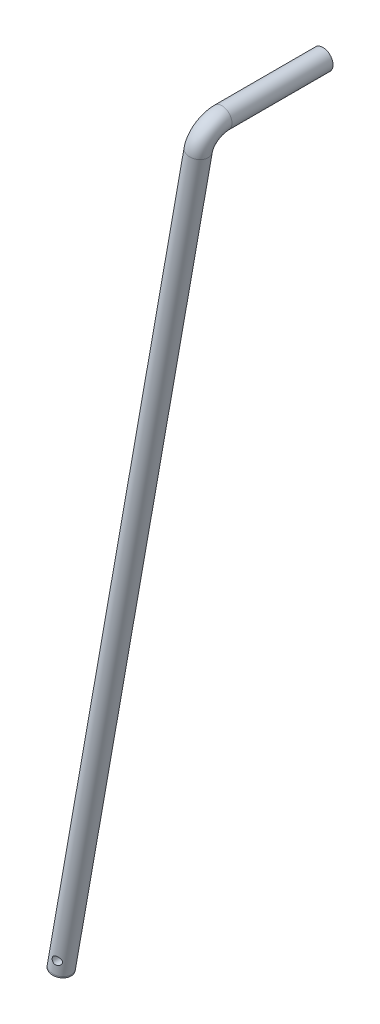
ISO-10303-21;
HEADER;
FILE_DESCRIPTION(('STEP AP214'),'2;1');
FILE_NAME('part.step','',(''),(''),'','','');
FILE_SCHEMA(('AUTOMOTIVE_DESIGN { 1 0 10303 214 1 1 1 1 }'));
ENDSEC;
DATA;
#1=APPLICATION_CONTEXT('core data for automotive mechanical design processes');
#2=APPLICATION_PROTOCOL_DEFINITION('international standard','automotive_design',2000,#1);
#3=PRODUCT_CONTEXT('',#1,'mechanical');
#4=PRODUCT('Part','Part','',(#3));
#5=PRODUCT_RELATED_PRODUCT_CATEGORY('part','',(#4));
#6=PRODUCT_DEFINITION_FORMATION('','',#4);
#7=PRODUCT_DEFINITION_CONTEXT('part definition',#1,'design');
#8=PRODUCT_DEFINITION('design','',#6,#7);
#9=PRODUCT_DEFINITION_SHAPE('','',#8);
#10=(LENGTH_UNIT() NAMED_UNIT(*) SI_UNIT(.MILLI.,.METRE.));
#11=(NAMED_UNIT(*) PLANE_ANGLE_UNIT() SI_UNIT($,.RADIAN.));
#12=(NAMED_UNIT(*) SI_UNIT($,.STERADIAN.) SOLID_ANGLE_UNIT());
#13=UNCERTAINTY_MEASURE_WITH_UNIT(LENGTH_MEASURE(1.E-05),#10,'distance_accuracy_value','');
#14=(GEOMETRIC_REPRESENTATION_CONTEXT(3) GLOBAL_UNCERTAINTY_ASSIGNED_CONTEXT((#13)) GLOBAL_UNIT_ASSIGNED_CONTEXT((#10,
#11,#12)) REPRESENTATION_CONTEXT('',''));
#15=CARTESIAN_POINT('',(0.,0.,0.));
#16=DIRECTION('',(0.,0.,1.));
#17=DIRECTION('',(1.,0.,0.));
#18=AXIS2_PLACEMENT_3D('',#15,#16,#17);
#19=CARTESIAN_POINT('',(285.309286775553,1958.34628023542,-234.999999999999));
#20=DIRECTION('',(0.,0.,1.));
#21=DIRECTION('',(0.,-1.,0.));
#22=AXIS2_PLACEMENT_3D('',#19,#20,#21);
#23=PLANE('',#22);
#24=CARTESIAN_POINT('',(345.309286775553,2018.34628023542,-235.));
#25=DIRECTION('',(0.,0.,-1.));
#26=DIRECTION('',(-0.984807753012209,0.173648177666924,0.));
#27=AXIS2_PLACEMENT_3D('',#24,#25,#26);
#28=CIRCLE('',#27,25.);
#29=CARTESIAN_POINT('',(320.689092950247,2022.68748467709,-235.));
#30=VERTEX_POINT('',#29);
#31=EDGE_CURVE('E12',#30,#30,#28,.T.);
#32=ORIENTED_EDGE('',*,*,#31,.T.);
#33=EDGE_LOOP('',(#32));
#34=FACE_BOUND('',#33,.T.);
#35=ADVANCED_FACE('F50',(#34),#23,.F.);
#36=CARTESIAN_POINT('',(-2.54866712700606,45.5457904583527,65.));
#37=DIRECTION('',(0.173648177666925,0.984807753012209,0.));
#38=DIRECTION('',(-0.984807753012209,0.173648177666925,0.));
#39=AXIS2_PLACEMENT_3D('',#36,#37,#38);
#40=PLANE('',#39);
#41=CARTESIAN_POINT('',(-2.54866712700606,45.5457904583527,65.));
#42=DIRECTION('',(0.173648177666925,0.984807753012209,0.));
#43=DIRECTION('',(-0.984807753012209,0.173648177666925,0.));
#44=AXIS2_PLACEMENT_3D('',#41,#42,#43);
#45=CIRCLE('',#44,25.);
#46=CARTESIAN_POINT('',(-27.1688609523113,49.8869949000258,65.));
#47=VERTEX_POINT('',#46);
#48=EDGE_CURVE('E66',#47,#47,#45,.T.);
#49=ORIENTED_EDGE('',*,*,#48,.F.);
#50=EDGE_LOOP('',(#49));
#51=FACE_BOUND('',#50,.T.);
#52=ADVANCED_FACE('F67',(#51),#40,.F.);
#53=CARTESIAN_POINT('',(-2.54866712700606,45.5457904583527,65.));
#54=DIRECTION('',(0.173648177666924,0.984807753012209,0.));
#55=DIRECTION('',(-0.984807753012209,0.173648177666924,0.));
#56=AXIS2_PLACEMENT_3D('',#53,#54,#55);
#57=CYLINDRICAL_SURFACE('',#56,25.);
#58=CARTESIAN_POINT('',(-1.98706855829563,48.7307742110036,65.));
#59=DIRECTION('',(0.173648177666925,0.984807753012209,0.));
#60=DIRECTION('',(-0.984807753012209,0.173648177666925,0.));
#61=AXIS2_PLACEMENT_3D('',#58,#59,#60);
#62=CIRCLE('',#61,25.);
#63=CARTESIAN_POINT('',(-26.6072623836009,53.0719786526767,65.));
#64=VERTEX_POINT('',#63);
#65=EDGE_CURVE('E69',#64,#64,#62,.T.);
#66=ORIENTED_EDGE('',*,*,#65,.F.);
#67=EDGE_LOOP('',(#66));
#68=FACE_BOUND('',#67,.T.);
#69=ORIENTED_EDGE('',*,*,#48,.T.);
#70=EDGE_LOOP('',(#69));
#71=FACE_BOUND('',#70,.T.);
#72=ADVANCED_FACE('F93',(#68,#71),#57,.T.);
#73=CARTESIAN_POINT('',(-1.98706855829562,48.7307742110036,65.));
#74=DIRECTION('',(0.173648177666924,0.984807753012209,0.));
#75=DIRECTION('',(-0.984807753012209,0.173648177666924,0.));
#76=AXIS2_PLACEMENT_3D('',#73,#74,#75);
#77=CYLINDRICAL_SURFACE('',#76,25.);
#78=CARTESIAN_POINT('',(5.05959495436735,88.694388879334,90.));
#79=CARTESIAN_POINT('',(4.81641099799029,88.5562025731366,89.9999995331166));
#80=CARTESIAN_POINT('',(4.57896534961769,88.4077695870217,89.9972100574864));
#81=CARTESIAN_POINT('',(4.11731780295449,88.0915026848093,89.9872417100885));
#82=CARTESIAN_POINT('',(3.89312380886007,87.9236573628454,89.9800602470415));
#83=CARTESIAN_POINT('',(3.45916867374251,87.5694215729024,89.9625140761051));
#84=CARTESIAN_POINT('',(3.24944168216102,87.382989605847,89.9521421320368));
#85=CARTESIAN_POINT('',(2.84644224802949,86.9932253451614,89.9294465335112));
#86=CARTESIAN_POINT('',(2.65317019114192,86.7898926556413,89.917122833329));
#87=CARTESIAN_POINT('',(2.28468782092185,86.3680661116852,89.8917226092728));
#88=CARTESIAN_POINT('',(2.10945035087738,86.1495959069343,89.8786472649217));
#89=CARTESIAN_POINT('',(1.77789615561468,85.6987118793375,89.8528175922824));
#90=CARTESIAN_POINT('',(1.62158005373771,85.4662975974983,89.840063274581));
#91=CARTESIAN_POINT('',(1.32905775816331,84.989286987599,89.8158595176162));
#92=CARTESIAN_POINT('',(1.19283828860028,84.7446988457455,89.8044092180673));
#93=CARTESIAN_POINT('',(0.9413498689262,84.2448933146005,89.7836292799645));
#94=CARTESIAN_POINT('',(0.826080729154653,83.9896760215589,89.7742996222127));
#95=CARTESIAN_POINT('',(0.616835990789955,83.4691886250571,89.7583719897132));
#96=CARTESIAN_POINT('',(0.522962007835889,83.2038772572979,89.7517869326652));
#97=CARTESIAN_POINT('',(0.357889364471851,82.6662297052887,89.7418627585988));
#98=CARTESIAN_POINT('',(0.286690827073224,82.3938934829384,89.7385236591891));
#99=CARTESIAN_POINT('',(0.167492018318252,81.8441522646798,89.7353174089191));
#100=CARTESIAN_POINT('',(0.119493201642445,81.5667469520584,89.7354504757436));
#101=CARTESIAN_POINT('',(0.0470494898587544,81.008902712,89.7391801974196));
#102=CARTESIAN_POINT('',(0.0226044176324381,80.7284638073909,89.7427768262255));
#103=CARTESIAN_POINT('',(-0.00244064836946922,80.1693958952261,89.7531375517377));
#104=CARTESIAN_POINT('',(-0.00327655242939336,79.890776816982,89.7598696274159));
#105=CARTESIAN_POINT('',(0.0182862748859155,79.334520913439,89.7760361338764));
#106=CARTESIAN_POINT('',(0.0406848729056904,79.0568840825116,89.7854705491484));
#107=CARTESIAN_POINT('',(0.108537222549816,78.5045473650764,89.8063912520517));
#108=CARTESIAN_POINT('',(0.153988949525856,78.2298472228159,89.8178773594351));
#109=CARTESIAN_POINT('',(0.267636640176752,77.6851490488258,89.8420848172385));
#110=CARTESIAN_POINT('',(0.335840604421221,77.4151527063252,89.8548066010533));
#111=CARTESIAN_POINT('',(0.495059053583454,76.8799725631527,89.8806046587933));
#112=CARTESIAN_POINT('',(0.586226331230476,76.614834296552,89.8936827619024));
#113=CARTESIAN_POINT('',(0.790509957299759,76.0931118958398,89.9190092022377));
#114=CARTESIAN_POINT('',(0.903626236877526,75.8365277349007,89.9312575420663));
#115=CARTESIAN_POINT('',(1.15107137881399,75.3336295519209,89.9537462393953));
#116=CARTESIAN_POINT('',(1.28540522092646,75.0873179580452,89.9639861242441));
#117=CARTESIAN_POINT('',(1.57429460804813,74.6068531058904,89.9812239192212));
#118=CARTESIAN_POINT('',(1.72884261282189,74.3726953592837,89.9882230338153));
#119=CARTESIAN_POINT('',(2.05730010695798,73.9178711706865,89.9977568523797));
#120=CARTESIAN_POINT('',(2.23123113835923,73.6972201703085,90.0002865354046));
#121=CARTESIAN_POINT('',(2.59704082096038,73.2713306294064,89.999661797293));
#122=CARTESIAN_POINT('',(2.78891952063372,73.0660921305114,89.9965073608043));
#123=CARTESIAN_POINT('',(3.18909219699702,72.6726370770169,89.9833896137306));
#124=CARTESIAN_POINT('',(3.39738166517068,72.4844158775749,89.9734281674987));
#125=CARTESIAN_POINT('',(3.82873127498465,72.1263733115063,89.9456962317714));
#126=CARTESIAN_POINT('',(4.05179089156781,71.9565512913811,89.9279260197397));
#127=CARTESIAN_POINT('',(4.50292545254095,71.642059333031,89.8845026865528));
#128=CARTESIAN_POINT('',(4.73056702784262,71.4967271936525,89.8591403697716));
#129=CARTESIAN_POINT('',(5.19600268082107,71.2253677780792,89.7997942654933));
#130=CARTESIAN_POINT('',(5.43379650010172,71.0993400109214,89.7658106973167));
#131=CARTESIAN_POINT('',(5.9175258852367,70.8673470503021,89.6888724453988));
#132=CARTESIAN_POINT('',(6.16346011902217,70.7613785932873,89.6459192233727));
#133=CARTESIAN_POINT('',(6.66147566444287,70.5699724601839,89.5509047475862));
#134=CARTESIAN_POINT('',(6.91355694738499,70.4845346882826,89.4988435363329));
#135=CARTESIAN_POINT('',(7.416394644859,70.3360340674721,89.3869146840745));
#136=CARTESIAN_POINT('',(7.66706408469123,70.2725317523199,89.3272378193177));
#137=CARTESIAN_POINT('',(8.17049793205187,70.1654103284427,89.199528839429));
#138=CARTESIAN_POINT('',(8.42326229658468,70.1217908126729,89.1314968953802));
#139=CARTESIAN_POINT('',(8.92918771596577,70.0542217198608,88.9875184475455));
#140=CARTESIAN_POINT('',(9.18234881751831,70.0302746653873,88.9115709301646));
#141=CARTESIAN_POINT('',(9.68746680922894,70.0016837860475,88.7523590761861));
#142=CARTESIAN_POINT('',(9.9394235776642,69.9970418728154,88.6690940158239));
#143=CARTESIAN_POINT('',(10.4540618689989,70.006824802006,88.4913467843884));
#144=CARTESIAN_POINT('',(10.7165987765985,70.0222796510915,88.3965032210716));
#145=CARTESIAN_POINT('',(11.2372744160987,70.0733896757187,88.2004413732091));
#146=CARTESIAN_POINT('',(11.495413027684,70.1090454029443,88.0992229146329));
#147=CARTESIAN_POINT('',(12.0060808594846,70.1998515149593,87.8914276987721));
#148=CARTESIAN_POINT('',(12.2586091227283,70.2550051988396,87.7848500373197));
#149=CARTESIAN_POINT('',(12.7569528884918,70.3841028352897,87.5674503614923));
#150=CARTESIAN_POINT('',(13.0027677800513,70.458048491782,87.4566279630091));
#151=CARTESIAN_POINT('',(13.5149064907976,70.6337308713898,87.2188325125025));
#152=CARTESIAN_POINT('',(13.7802903541242,70.7376996242925,87.0914801750277));
#153=CARTESIAN_POINT('',(14.3003965834876,70.967424081538,86.8346586824928));
#154=CARTESIAN_POINT('',(14.5551181372257,71.09318144209,86.7051893671936));
#155=CARTESIAN_POINT('',(15.0532390819145,71.3660240565292,86.4457802112398));
#156=CARTESIAN_POINT('',(15.2966204664575,71.5131417986235,86.315839953227));
#157=CARTESIAN_POINT('',(15.7706053720632,71.8280313447219,86.0577050444134));
#158=CARTESIAN_POINT('',(16.001209140428,71.9958027487862,85.9295103598646));
#159=CARTESIAN_POINT('',(16.4675152027932,72.3666942745716,85.6663814366943));
#160=CARTESIAN_POINT('',(16.7019957673579,72.571604662709,85.5317956863599));
#161=CARTESIAN_POINT('',(17.1530908021878,73.0049222412481,85.2704430855777));
#162=CARTESIAN_POINT('',(17.3697015243475,73.2333343385473,85.1436778768464));
#163=CARTESIAN_POINT('',(17.7825931496162,73.7126254219718,84.9018982119849));
#164=CARTESIAN_POINT('',(17.9789178122888,73.9634537756548,84.7868584701689));
#165=CARTESIAN_POINT('',(18.3493241884488,74.4871517244266,84.5723195198798));
#166=CARTESIAN_POINT('',(18.523419248596,74.7600079318114,84.4728109784124));
#167=CARTESIAN_POINT('',(18.7930718366411,75.2324574968578,84.3233256455235));
#168=CARTESIAN_POINT('',(18.895549193517,75.4264004196047,84.267857019588));
#169=CARTESIAN_POINT('',(19.0884007277011,75.8227398940558,84.1670953857188));
#170=CARTESIAN_POINT('',(19.1787783345135,76.0251340289549,84.1217994919902));
#171=CARTESIAN_POINT('',(19.3464367512106,76.4372001462005,84.0426120348139));
#172=CARTESIAN_POINT('',(19.4237313241888,76.6468641973456,84.0087084494105));
#173=CARTESIAN_POINT('',(19.5644858866362,77.0724027917516,83.9532296606161));
#174=CARTESIAN_POINT('',(19.6279455325168,77.2882774891024,83.9316547633849));
#175=CARTESIAN_POINT('',(19.7405488823906,77.725599272133,83.9014539367893));
#176=CARTESIAN_POINT('',(19.7896314647146,77.947065922226,83.8928826633898));
#177=CARTESIAN_POINT('',(19.872627050043,78.3929354303913,83.8891465738809));
#178=CARTESIAN_POINT('',(19.9065401277409,78.6173382740003,83.8939816917587));
#179=CARTESIAN_POINT('',(19.9589878369209,79.0673218607576,83.9169002141098));
#180=CARTESIAN_POINT('',(19.9775178257741,79.2929029388432,83.9349876150348));
#181=CARTESIAN_POINT('',(19.9992515699041,79.7434142751312,83.9838294247482));
#182=CARTESIAN_POINT('',(20.002455280515,79.9683445314349,84.0145838704522));
#183=CARTESIAN_POINT('',(19.9940770114996,80.4042595484544,84.0859135446412));
#184=CARTESIAN_POINT('',(19.9832600797728,80.6153580644149,84.1258905552191));
#185=CARTESIAN_POINT('',(19.9485775568954,81.0344444871785,84.2153933385224));
#186=CARTESIAN_POINT('',(19.9247079983524,81.2424314284501,84.2649220115451));
#187=CARTESIAN_POINT('',(19.8342241289604,81.8604229819108,84.4262570714187));
#188=CARTESIAN_POINT('',(19.748732800425,82.2645365687836,84.5508259477581));
#189=CARTESIAN_POINT('',(19.5633716985869,82.9370331756336,84.78507378652));
#190=CARTESIAN_POINT('',(19.4748120529544,83.2108682023184,84.8886388905993));
#191=CARTESIAN_POINT('',(19.275995277698,83.7466618509404,85.1053553774169));
#192=CARTESIAN_POINT('',(19.165737309915,84.008620013619,85.2185071303704));
#193=CARTESIAN_POINT('',(18.9246313086534,84.5200705961407,85.4518267585754));
#194=CARTESIAN_POINT('',(18.7937548691128,84.7695451831873,85.5720041672528));
#195=CARTESIAN_POINT('',(18.5125876709122,85.2549502101151,85.8168116829551));
#196=CARTESIAN_POINT('',(18.3622985100865,85.4908817623989,85.9414414229045));
#197=CARTESIAN_POINT('',(18.0411982942554,85.9513778328643,86.1945679916782));
#198=CARTESIAN_POINT('',(17.8701556436582,86.1757648844844,86.3230936200626));
#199=CARTESIAN_POINT('',(17.5097886115509,86.6092777324451,86.580538077853));
#200=CARTESIAN_POINT('',(17.3204571204932,86.8183975379289,86.7094570411505));
#201=CARTESIAN_POINT('',(16.9243090597382,87.2203572669505,86.9657811603289));
#202=CARTESIAN_POINT('',(16.7174934501077,87.4131980832199,87.0931863988919));
#203=CARTESIAN_POINT('',(16.2872113757092,87.7814605970001,87.3447129298592));
#204=CARTESIAN_POINT('',(16.0637518667425,87.9568895005721,87.4688355650626));
#205=CARTESIAN_POINT('',(15.5802916664701,88.3040112182506,87.7230927382475));
#206=CARTESIAN_POINT('',(15.3188092076507,88.4739779249583,87.8527773090779));
#207=CARTESIAN_POINT('',(14.7782747188752,88.7901147584178,88.1044436240094));
#208=CARTESIAN_POINT('',(14.4992213386496,88.9362830532346,88.2264247746809));
#209=CARTESIAN_POINT('',(13.9253775488316,89.2027944764376,88.4607967897025));
#210=CARTESIAN_POINT('',(13.6305957861514,89.3231516158759,88.5731928370662));
#211=CARTESIAN_POINT('',(13.0272926165184,89.5361305027929,88.786834097023));
#212=CARTESIAN_POINT('',(12.7187733344709,89.6287565226906,88.8880810257937));
#213=CARTESIAN_POINT('',(12.1212265519482,89.7767940198968,89.0688227512911));
#214=CARTESIAN_POINT('',(11.8332282757187,89.8349518859937,89.149475744055));
#215=CARTESIAN_POINT('',(11.250438652365,89.9258931940938,89.2998673302445));
#216=CARTESIAN_POINT('',(10.955647633831,89.9586778608505,89.3696064503482));
#217=CARTESIAN_POINT('',(10.3618993855281,89.9978766978043,89.4977046920896));
#218=CARTESIAN_POINT('',(10.0629426937374,90.0042942420997,89.5560652688847));
#219=CARTESIAN_POINT('',(9.46366665388995,89.99010250542,89.6612891453882));
#220=CARTESIAN_POINT('',(9.16334747815867,89.969496552331,89.7081538599439));
#221=CARTESIAN_POINT('',(8.59665676759597,89.9046945337341,89.7861717163462));
#222=CARTESIAN_POINT('',(8.33012039030571,89.8632852598477,89.8184748211275));
#223=CARTESIAN_POINT('',(7.80041373993025,89.758825581867,89.87452988746));
#224=CARTESIAN_POINT('',(7.53724330220652,89.6957762404867,89.8982822688082));
#225=CARTESIAN_POINT('',(7.01687517739377,89.5485053696608,89.9378007068067));
#226=CARTESIAN_POINT('',(6.75966652974796,89.4643267319793,89.9535827498164));
#227=CARTESIAN_POINT('',(6.25273181034603,89.2752950114712,89.9780048021905));
#228=CARTESIAN_POINT('',(6.00300193606116,89.170452647848,89.9866485025189));
#229=CARTESIAN_POINT('',(5.63924378348437,89.0000557756145,89.9948684360208));
#230=CARTESIAN_POINT('',(5.5216411040861,88.9421185318342,89.9968219903652));
#231=CARTESIAN_POINT('',(5.28880394104801,88.8216670931864,89.9993878141496));
#232=CARTESIAN_POINT('',(5.17356921980972,88.7591533604194,90.0000002188166));
#233=CARTESIAN_POINT('',(5.05959495436735,88.694388879334,90.));
#234=B_SPLINE_CURVE_WITH_KNOTS('',3,(#78,#79,#80,#81,#82,#83,#84,#85,#86,#87,#88,#89,#90,#91,
#92,#93,#94,#95,#96,#97,#98,#99,#100,#101,#102,#103,#104,#105,#106,#107,#108,#109,#110,#111,
#112,#113,#114,#115,#116,#117,#118,#119,#120,#121,#122,#123,#124,#125,#126,#127,#128,#129,#130,
#131,#132,#133,#134,#135,#136,#137,#138,#139,#140,#141,#142,#143,#144,#145,#146,#147,#148,#149,
#150,#151,#152,#153,#154,#155,#156,#157,#158,#159,#160,#161,#162,#163,#164,#165,#166,#167,#168,
#169,#170,#171,#172,#173,#174,#175,#176,#177,#178,#179,#180,#181,#182,#183,#184,#185,#186,#187,
#188,#189,#190,#191,#192,#193,#194,#195,#196,#197,#198,#199,#200,#201,#202,#203,#204,#205,#206,
#207,#208,#209,#210,#211,#212,#213,#214,#215,#216,#217,#218,#219,#220,#221,#222,#223,#224,#225,
#226,#227,#228,#229,#230,#231,#232,#233),.UNSPECIFIED.,.T.,.F.,(4,2,2,2,2,2,2,2,2,2,2,2,2,2,2,2,
2,2,2,2,2,2,2,2,2,2,2,2,2,2,2,2,2,2,2,2,2,2,2,2,2,2,2,2,2,2,2,2,2,2,2,2,2,2,2,2,2,2,2,2,2,2,2,2,
2,2,2,2,2,2,2,2,2,2,2,2,2,4),(0.,0.838983226747251,1.67846193306487,2.51985883764149,
3.36127545702896,4.2014059286919,5.04156406989394,5.88116469200302,6.72075771294259,
7.56425890557387,8.40776467401157,9.2513233255125,10.0948756336079,10.9299958855737,
11.7651113443561,12.6001534715572,13.4354895420413,14.2765377736967,15.1175833673914,
15.9588266482846,16.7997570209406,17.6416314929037,18.4835082386844,19.3251544975189,
20.1667708531063,20.9795647000742,21.7923378720343,22.6049786958393,23.4176157271361,
24.2128723118656,25.0081126152078,25.8034548750535,26.598875889431,27.4367156724713,
28.2745783379291,29.1125828392255,29.9506633519357,30.8862201274464,31.8218480483036,
32.7589142222975,33.6959622536859,34.712356244743,35.7289628799367,36.74332865941,
37.7570825206381,38.4352268402954,39.1131785406858,39.7904125559128,40.4676633882446,
41.1477529857265,41.8278392344622,42.5081306592492,43.1884240666301,43.8331136777412,
44.4779993535634,45.7675347828438,46.684102746629,47.6007061223993,48.5185835271545,
49.4363854307638,50.3655807888285,51.2951388243108,52.2246458501352,53.1537665737212,
54.1656858930076,55.1776830702116,56.1891295073216,57.2004200347694,58.1131890679028,
59.0259140393164,59.9385222092154,60.8510180039139,61.6650061792405,62.4789543864401,
63.2912634828926,64.103152301936,64.4964025038191,64.8896130527861),.UNSPECIFIED.);
#235=CARTESIAN_POINT('',(5.05959495436735,88.694388879334,90.));
#236=VERTEX_POINT('',#235);
#237=EDGE_CURVE('E53',#236,#236,#234,.T.);
#238=ORIENTED_EDGE('',*,*,#237,.F.);
#239=EDGE_LOOP('',(#238));
#240=FACE_BOUND('',#239,.T.);
#241=CARTESIAN_POINT('',(0.,80.,40.2424047178006));
#242=CARTESIAN_POINT('',(1.65113800065456E-06,80.2785612560375,40.2491889617556));
#243=CARTESIAN_POINT('',(0.0116497796994484,80.5572158120155,40.2545050876965));
#244=CARTESIAN_POINT('',(0.0581904255137259,81.1127334677519,40.2618387729997));
#245=CARTESIAN_POINT('',(0.0930946955832198,81.389595590211,40.2638546627599));
#246=CARTESIAN_POINT('',(0.186005307789584,81.9399845002533,40.2644516204284));
#247=CARTESIAN_POINT('',(0.24405662231004,82.213503720385,40.2630259743641));
#248=CARTESIAN_POINT('',(0.382831672191504,82.7546491402316,40.2568205529097));
#249=CARTESIAN_POINT('',(0.46355250039413,83.0222760908335,40.2520412074832));
#250=CARTESIAN_POINT('',(0.646978597798271,83.5494789794681,40.2394566307328));
#251=CARTESIAN_POINT('',(0.7496593796754,83.8090635193815,40.2316547619947));
#252=CARTESIAN_POINT('',(0.976320361728891,84.318678085063,40.2135552660332));
#253=CARTESIAN_POINT('',(1.10030125862992,84.5687077979665,40.2032575571665));
#254=CARTESIAN_POINT('',(1.36859884285691,85.0573265036386,40.1808938327202));
#255=CARTESIAN_POINT('',(1.51290328726829,85.295922269092,40.1688288815542));
#256=CARTESIAN_POINT('',(1.82097102255359,85.7603092089821,40.1438023141183));
#257=CARTESIAN_POINT('',(1.9847432471771,85.9860944339141,40.1308402873297));
#258=CARTESIAN_POINT('',(2.33170040473526,86.424629298308,40.1049561770594));
#259=CARTESIAN_POINT('',(2.51500477144978,86.6372845094048,40.0920349029133));
#260=CARTESIAN_POINT('',(2.89879247317672,87.0463805404159,40.0674620768018));
#261=CARTESIAN_POINT('',(3.09926790750439,87.2428287366193,40.0558099464298));
#262=CARTESIAN_POINT('',(3.5161631009168,87.6183055712764,40.0349703067076));
#263=CARTESIAN_POINT('',(3.73258817132219,87.7973283604909,40.0257836231356));
#264=CARTESIAN_POINT('',(4.17981091680642,88.1365947030665,40.0111182611009));
#265=CARTESIAN_POINT('',(4.41060848289623,88.296838398806,40.0056395545237));
#266=CARTESIAN_POINT('',(4.88443087040486,88.5970604376703,39.9996270533564));
#267=CARTESIAN_POINT('',(5.12742955636837,88.7370797996482,39.9990831074888));
#268=CARTESIAN_POINT('',(5.62428468373806,88.9961999450393,40.0040877271957));
#269=CARTESIAN_POINT('',(5.87814113023823,89.1153007186382,40.0096362956285));
#270=CARTESIAN_POINT('',(6.39466437961017,89.3316628613017,40.0279031155178));
#271=CARTESIAN_POINT('',(6.65732850581308,89.428930797491,40.040619206995));
#272=CARTESIAN_POINT('',(7.1894163487346,89.6009785852552,40.0741588018145));
#273=CARTESIAN_POINT('',(7.45883982265881,89.675759243319,40.0949820143398));
#274=CARTESIAN_POINT('',(7.99237211664729,89.8000880697965,40.1445751723827));
#275=CARTESIAN_POINT('',(8.25632058206319,89.8504512142107,40.1730303706434));
#276=CARTESIAN_POINT('',(8.78634609757407,89.9296948831404,40.238653272288));
#277=CARTESIAN_POINT('',(9.05242308954057,89.9585759923037,40.2758207385254));
#278=CARTESIAN_POINT('',(9.58459388058334,89.9949268905119,40.359133311422));
#279=CARTESIAN_POINT('',(9.85068767298907,90.0023994597802,40.4052772515186));
#280=CARTESIAN_POINT('',(10.3808995964616,89.9962596786914,40.506595755717));
#281=CARTESIAN_POINT('',(10.6450177265344,89.9826473177275,40.5617703243615));
#282=CARTESIAN_POINT('',(11.1650849296807,89.9352729180325,40.6800111543428));
#283=CARTESIAN_POINT('',(11.4210969935928,89.9018425220699,40.7429343163823));
#284=CARTESIAN_POINT('',(11.9276704578135,89.8158083663208,40.8770085433551));
#285=CARTESIAN_POINT('',(12.1782319518697,89.7632049365793,40.9481594666411));
#286=CARTESIAN_POINT('',(12.6724494923779,89.6396528316044,41.0981902862435));
#287=CARTESIAN_POINT('',(12.9161045300174,89.5687014914942,41.1770713042555));
#288=CARTESIAN_POINT('',(13.3951954357906,89.4093777776126,41.3419132144085));
#289=CARTESIAN_POINT('',(13.6306304596572,89.3210036205254,41.4278748307606));
#290=CARTESIAN_POINT('',(14.106252341228,89.1219049802974,41.611560714353));
#291=CARTESIAN_POINT('',(14.3458522152122,89.010145585569,41.7096826821446));
#292=CARTESIAN_POINT('',(14.8134456665489,88.7692599813823,41.9120359510925));
#293=CARTESIAN_POINT('',(15.0414388715782,88.6401332152902,42.0162674480022));
#294=CARTESIAN_POINT('',(15.4849707707879,88.3655922931341,42.2297707629773));
#295=CARTESIAN_POINT('',(15.7005070436958,88.2201749866859,42.3390435535535));
#296=CARTESIAN_POINT('',(16.1183560390508,87.9140890322817,42.5614585011007));
#297=CARTESIAN_POINT('',(16.3206675816194,87.753419026644,42.6746010019501));
#298=CARTESIAN_POINT('',(16.7346244626867,87.3978279117809,42.9171186434439));
#299=CARTESIAN_POINT('',(16.9445293024218,87.2011047776707,43.0468270285704));
#300=CARTESIAN_POINT('',(17.3462115334377,86.7908474222584,43.3077399917574));
#301=CARTESIAN_POINT('',(17.5379874831153,86.5773118665086,43.4389446878759));
#302=CARTESIAN_POINT('',(17.902929248073,86.1340252276299,43.7011030303413));
#303=CARTESIAN_POINT('',(18.0760640158089,85.9042481163913,43.8320559116846));
#304=CARTESIAN_POINT('',(18.4025051986222,85.4296283892911,44.0913314080348));
#305=CARTESIAN_POINT('',(18.5558124109866,85.1847863797895,44.2196541286286));
#306=CARTESIAN_POINT('',(18.8521272671496,84.6622481339345,44.4805313369511));
#307=CARTESIAN_POINT('',(18.9935523878127,84.3834595533085,44.6127048304402));
#308=CARTESIAN_POINT('',(19.2509784220989,83.8102633811392,44.8679524207256));
#309=CARTESIAN_POINT('',(19.3669740464764,83.5158525560108,44.9910246209641));
#310=CARTESIAN_POINT('',(19.5714419061564,82.9134865909926,45.2239274094309));
#311=CARTESIAN_POINT('',(19.6599849583013,82.6055686790293,45.3337916126822));
#312=CARTESIAN_POINT('',(19.807848760194,81.97738348069,45.5363958698742));
#313=CARTESIAN_POINT('',(19.8671886719868,81.6571244412964,45.6291471276653));
#314=CARTESIAN_POINT('',(19.9396558629261,81.1180128855445,45.7651789683378));
#315=CARTESIAN_POINT('',(19.9616428905236,80.9018482749753,45.8145406007012));
#316=CARTESIAN_POINT('',(19.991496692156,80.4664429274804,45.9027606539253));
#317=CARTESIAN_POINT('',(19.9993674933588,80.2472030858704,45.9416220676679));
#318=CARTESIAN_POINT('',(20.000558658779,79.8071472094978,46.0077628897136));
#319=CARTESIAN_POINT('',(19.9938931575712,79.5863329137894,46.0350535182076));
#320=CARTESIAN_POINT('',(19.9657928856112,79.1444417093555,46.0773015527241));
#321=CARTESIAN_POINT('',(19.9443576648961,78.9233647928339,46.0922585829701));
#322=CARTESIAN_POINT('',(19.8866236956885,78.4819909750891,46.1093923096678));
#323=CARTESIAN_POINT('',(19.8502813370716,78.2616982916588,46.1115312182799));
#324=CARTESIAN_POINT('',(19.762992197057,77.8242882597891,46.1028587004589));
#325=CARTESIAN_POINT('',(19.7120454567791,77.6071709024112,46.0920473104881));
#326=CARTESIAN_POINT('',(19.5960386701539,77.1776697175884,46.057812880959));
#327=CARTESIAN_POINT('',(19.5309727961962,76.9652878847452,46.0343846279117));
#328=CARTESIAN_POINT('',(19.3874579808877,76.5468020562924,45.9756285046599));
#329=CARTESIAN_POINT('',(19.3090088152186,76.3406981659762,45.9403004349919));
#330=CARTESIAN_POINT('',(19.1421417210454,75.9421074888296,45.859977058365));
#331=CARTESIAN_POINT('',(19.0540990959964,75.749397233248,45.81530808658));
#332=CARTESIAN_POINT('',(18.8670250571359,75.3717903952276,45.7167804344439));
#333=CARTESIAN_POINT('',(18.7679894694454,75.1868968177216,45.6629182593561));
#334=CARTESIAN_POINT('',(18.455526751209,74.6448301898735,45.489204263403));
#335=CARTESIAN_POINT('',(18.2267105834139,74.3001931534492,45.3572084730603));
#336=CARTESIAN_POINT('',(17.8034316569861,73.7395608996367,45.1104629683527));
#337=CARTESIAN_POINT('',(17.6173228537656,73.5145886813268,45.0012531996477));
#338=CARTESIAN_POINT('',(17.2286523586522,73.08403004869,44.7738593146644));
#339=CARTESIAN_POINT('',(17.0260849748205,72.878450394546,44.655672094605));
#340=CARTESIAN_POINT('',(16.6057936206834,72.4869369974327,44.4129807822067));
#341=CARTESIAN_POINT('',(16.3880509055116,72.3010282922379,44.2884689309155));
#342=CARTESIAN_POINT('',(15.9388685981194,71.9494620152574,44.0357188384568));
#343=CARTESIAN_POINT('',(15.707430192811,71.7838026923992,43.9074809206909));
#344=CARTESIAN_POINT('',(15.2293059181064,71.4714126566556,43.6480403949684));
#345=CARTESIAN_POINT('',(14.9824804697698,71.3249098941719,43.5168206941963));
#346=CARTESIAN_POINT('',(14.4768596796207,71.0534873424618,43.2547946985873));
#347=CARTESIAN_POINT('',(14.2180592750739,70.9285767895875,43.1239886040475));
#348=CARTESIAN_POINT('',(13.6896977259842,70.7011379862757,42.8647537495017));
#349=CARTESIAN_POINT('',(13.4201381485218,70.5986064902841,42.7363246472447));
#350=CARTESIAN_POINT('',(12.8715377131218,70.4167993641328,42.4836489832627));
#351=CARTESIAN_POINT('',(12.5925012239196,70.3375131762882,42.3594005455098));
#352=CARTESIAN_POINT('',(12.0077471113608,70.1987237782053,42.1087778445631));
#353=CARTESIAN_POINT('',(11.7014747912602,70.1408434738813,41.9827912982147));
#354=CARTESIAN_POINT('',(11.0815384940277,70.0537320910479,41.7392450700223));
#355=CARTESIAN_POINT('',(10.7678740544082,70.024502809988,41.6216859173077));
#356=CARTESIAN_POINT('',(10.1357248247442,69.9959198894354,41.3967809956929));
#357=CARTESIAN_POINT('',(9.81724285634081,69.9965493909922,41.2894294976284));
#358=CARTESIAN_POINT('',(9.17813312128656,70.0286982804112,41.0863751643091));
#359=CARTESIAN_POINT('',(8.8575057031517,70.0602127666296,40.9906704833397));
#360=CARTESIAN_POINT('',(8.25155133343141,70.1497988908503,40.8216374452091));
#361=CARTESIAN_POINT('',(7.96611158684206,70.2046746212726,40.7470109189796));
#362=CARTESIAN_POINT('',(7.39864611729675,70.3398755288226,40.6085821499064));
#363=CARTESIAN_POINT('',(7.11662016634488,70.4201989965363,40.5447791804484));
#364=CARTESIAN_POINT('',(6.55883956872365,70.6061300234023,40.4283299108529));
#365=CARTESIAN_POINT('',(6.28308152258224,70.7117235005727,40.3756774276824));
#366=CARTESIAN_POINT('',(5.74043831895939,70.9477267725238,40.2814614973355));
#367=CARTESIAN_POINT('',(5.47355251504531,71.0781347546408,40.2398972407128));
#368=CARTESIAN_POINT('',(4.97779300488312,71.3484735179757,40.1711572798723));
#369=CARTESIAN_POINT('',(4.74780493599068,71.4861068976592,40.142951443504));
#370=CARTESIAN_POINT('',(4.29903773872128,71.779845635939,40.0947152631368));
#371=CARTESIAN_POINT('',(4.08025848562438,71.9359507889368,40.0746848281533));
#372=CARTESIAN_POINT('',(3.65568292745036,72.2655408328534,40.0421333264328));
#373=CARTESIAN_POINT('',(3.44988444744799,72.4390227996178,40.0296109987078));
#374=CARTESIAN_POINT('',(3.05278702568841,72.8021790569705,40.0112417171338));
#375=CARTESIAN_POINT('',(2.86148836887918,72.9918536656182,40.0053948944391));
#376=CARTESIAN_POINT('',(2.49641954109535,73.3843016157704,39.999454171527));
#377=CARTESIAN_POINT('',(2.32250818825651,73.5869429679628,39.9993094009565));
#378=CARTESIAN_POINT('',(1.991467013687,74.0054534747462,40.0036384497637));
#379=CARTESIAN_POINT('',(1.83433761907905,74.2213229657906,40.0081123866627));
#380=CARTESIAN_POINT('',(1.53779037720478,74.6649975058829,40.0206315192275));
#381=CARTESIAN_POINT('',(1.39838382339307,74.8928100360692,40.0286789775068));
#382=CARTESIAN_POINT('',(1.13827496974338,75.3587688665094,40.0472795370705));
#383=CARTESIAN_POINT('',(1.01757265010614,75.5969151558241,40.0578326357026));
#384=CARTESIAN_POINT('',(0.791269453039105,76.0915336628511,40.0808385242114));
#385=CARTESIAN_POINT('',(0.686444166290036,76.3483583366127,40.0933494843034));
#386=CARTESIAN_POINT('',(0.498491379029884,76.8698019744636,40.1188239238899));
#387=CARTESIAN_POINT('',(0.415363650857992,77.13442085674,40.1317873986347));
#388=CARTESIAN_POINT('',(0.271500112835945,77.6691602839194,40.1571101762108));
#389=CARTESIAN_POINT('',(0.210722227457308,77.9392694701948,40.1694705759212));
#390=CARTESIAN_POINT('',(0.111783322122698,78.4835511665817,40.1926996638903));
#391=CARTESIAN_POINT('',(0.073610836934407,78.7577215444445,40.2035691061945));
#392=CARTESIAN_POINT('',(0.0312566421064445,79.1936352176134,40.219006562933));
#393=CARTESIAN_POINT('',(0.0195398759316423,79.3546558178075,40.2243138692508));
#394=CARTESIAN_POINT('',(0.00391094614443013,79.6771071543553,40.2340467901803));
#395=CARTESIAN_POINT('',(-9.5704690893829E-07,79.8385379042143,40.2384723753676));
#396=CARTESIAN_POINT('',(0.,80.,40.2424047178006));
#397=B_SPLINE_CURVE_WITH_KNOTS('',3,(#241,#242,#243,#244,#245,#246,#247,#248,#249,#250,#251,
#252,#253,#254,#255,#256,#257,#258,#259,#260,#261,#262,#263,#264,#265,#266,#267,#268,#269,#270,
#271,#272,#273,#274,#275,#276,#277,#278,#279,#280,#281,#282,#283,#284,#285,#286,#287,#288,#289,
#290,#291,#292,#293,#294,#295,#296,#297,#298,#299,#300,#301,#302,#303,#304,#305,#306,#307,#308,
#309,#310,#311,#312,#313,#314,#315,#316,#317,#318,#319,#320,#321,#322,#323,#324,#325,#326,#327,
#328,#329,#330,#331,#332,#333,#334,#335,#336,#337,#338,#339,#340,#341,#342,#343,#344,#345,#346,
#347,#348,#349,#350,#351,#352,#353,#354,#355,#356,#357,#358,#359,#360,#361,#362,#363,#364,#365,
#366,#367,#368,#369,#370,#371,#372,#373,#374,#375,#376,#377,#378,#379,#380,#381,#382,#383,#384,
#385,#386,#387,#388,#389,#390,#391,#392,#393,#394,#395,#396),.UNSPECIFIED.,.T.,.F.,(4,2,2,2,2,2,
2,2,2,2,2,2,2,2,2,2,2,2,2,2,2,2,2,2,2,2,2,2,2,2,2,2,2,2,2,2,2,2,2,2,2,2,2,2,2,2,2,2,2,2,2,2,2,2,
2,2,2,2,2,2,2,2,2,2,2,2,2,2,2,2,2,2,2,2,2,2,2,4),(0.,0.835782847707389,1.67198839066456,
2.50982657585861,3.34755736497137,4.18435883462823,5.0211876811922,5.85751456087927,
6.69422672280802,7.53638577109655,8.37815938888701,9.22021459993289,10.0622634263114,
10.902579683508,11.7428963349491,12.5829598868317,13.4229933068845,14.2326363588973,
15.0422573751341,15.8517732450439,16.6612895221842,17.4576269444565,18.2539506592064,
19.0503900981803,19.8469110992309,20.6920461849072,21.537208364089,22.3825342700126,
23.2279354912347,24.1736402373539,25.1194201224541,26.0667516333655,27.0140450392251,
28.0308866145745,29.0479394891432,30.062346508923,31.0760870210542,31.7439040169638,
32.4115304634206,33.0785080235362,33.7455059041763,34.4144691319745,35.0834304762753,
35.7526684584064,36.4219176587847,37.0708328783374,37.7199953304718,39.0180634732801,
39.9522061896877,40.8866733509502,41.8223159734262,42.7578776285471,43.7037176502586,
44.6499612716352,45.5960675713849,46.5417434951849,47.5489520859213,48.5562238608128,
49.5629269138342,50.5694702225367,51.4685104129771,52.367490224531,53.2659702317924,
54.1643846315744,54.97192630944,55.7794589998776,56.5868560270245,57.3942689168846,
58.1944768971001,58.9947052388007,59.7954409777439,60.5961758690667,61.4282388538185,
62.26029310783,63.0907728292019,63.920830978031,64.4052585313754,64.8897022481082),.UNSPECIFIED.);
#398=CARTESIAN_POINT('',(0.,80.,40.2424047178006));
#399=VERTEX_POINT('',#398);
#400=EDGE_CURVE('E70',#399,#399,#397,.T.);
#401=ORIENTED_EDGE('',*,*,#400,.F.);
#402=EDGE_LOOP('',(#401));
#403=FACE_BOUND('',#402,.T.);
#404=CARTESIAN_POINT('',(336.626877892206,1969.10589258481,65.));
#405=DIRECTION('',(0.173648177666925,0.984807753012209,0.));
#406=DIRECTION('',(-0.984807753012209,0.173648177666925,0.));
#407=AXIS2_PLACEMENT_3D('',#404,#405,#406);
#408=CIRCLE('',#407,25.);
#409=CARTESIAN_POINT('',(336.626877892206,1969.10589258481,89.9999999999998));
#410=VERTEX_POINT('',#409);
#411=EDGE_CURVE('E73',#410,#410,#408,.T.);
#412=ORIENTED_EDGE('',*,*,#411,.F.);
#413=EDGE_LOOP('',(#412));
#414=FACE_BOUND('',#413,.T.);
#415=ORIENTED_EDGE('',*,*,#65,.T.);
#416=EDGE_LOOP('',(#415));
#417=FACE_BOUND('',#416,.T.);
#418=ADVANCED_FACE('F84',(#240,#403,#414,#417),#77,.T.);
#419=CARTESIAN_POINT('',(336.626877892206,1969.10589258481,14.9999999999998));
#420=DIRECTION('',(-0.984807753012209,0.173648177666924,0.));
#421=DIRECTION('',(-0.173648177666924,-0.984807753012209,0.));
#422=AXIS2_PLACEMENT_3D('',#419,#420,#421);
#423=TOROIDAL_SURFACE('',#422,50.,25.);
#424=CARTESIAN_POINT('',(345.309286775553,2018.34628023542,14.9999999999998));
#425=DIRECTION('',(0.,0.,-1.));
#426=DIRECTION('',(-0.984807753012209,0.173648177666924,0.));
#427=AXIS2_PLACEMENT_3D('',#424,#425,#426);
#428=CIRCLE('',#427,25.);
#429=CARTESIAN_POINT('',(349.650491217226,2042.96647406073,14.9999999999998));
#430=VERTEX_POINT('',#429);
#431=EDGE_CURVE('E79',#430,#430,#428,.T.);
#432=CARTESIAN_POINT('',(336.626877892206,1969.10589258481,14.9999999999998));
#433=DIRECTION('',(-0.984807753012209,0.173648177666924,0.));
#434=DIRECTION('',(-0.173648177666924,-0.984807753012209,0.));
#435=AXIS2_PLACEMENT_3D('',#432,#433,#434);
#436=CIRCLE('',#435,75.);
#437=EDGE_CURVE('',#410,#430,#436,.T.);
#438=ORIENTED_EDGE('',*,*,#411,.T.);
#439=ORIENTED_EDGE('',*,*,#431,.F.);
#440=ORIENTED_EDGE('',*,*,#437,.T.);
#441=ORIENTED_EDGE('',*,*,#437,.F.);
#442=EDGE_LOOP('',(#438,#440,#439,#441));
#443=FACE_BOUND('',#442,.T.);
#444=ADVANCED_FACE('F101',(#443),#423,.T.);
#445=CARTESIAN_POINT('',(345.309286775553,2018.34628023542,14.9999999999998));
#446=DIRECTION('',(0.,0.,-1.));
#447=DIRECTION('',(0.,1.,0.));
#448=AXIS2_PLACEMENT_3D('',#445,#446,#447);
#449=CYLINDRICAL_SURFACE('',#448,25.);
#450=ORIENTED_EDGE('',*,*,#31,.F.);
#451=EDGE_LOOP('',(#450));
#452=FACE_BOUND('',#451,.T.);
#453=ORIENTED_EDGE('',*,*,#431,.T.);
#454=EDGE_LOOP('',(#453));
#455=FACE_BOUND('',#454,.T.);
#456=ADVANCED_FACE('F91',(#452,#455),#449,.T.);
#457=CARTESIAN_POINT('',(10.,80.,30.));
#458=DIRECTION('',(0.,0.,-1.));
#459=DIRECTION('',(-1.,0.,0.));
#460=AXIS2_PLACEMENT_3D('',#457,#458,#459);
#461=CYLINDRICAL_SURFACE('',#460,9.99999999999998);
#462=ORIENTED_EDGE('',*,*,#237,.T.);
#463=EDGE_LOOP('',(#462));
#464=FACE_BOUND('',#463,.T.);
#465=ORIENTED_EDGE('',*,*,#400,.T.);
#466=EDGE_LOOP('',(#465));
#467=FACE_BOUND('',#466,.T.);
#468=ADVANCED_FACE('F88',(#464,#467),#461,.F.);
#469=CLOSED_SHELL('',(#35,#52,#72,#418,#444,#456,#468));
#470=MANIFOLD_SOLID_BREP('B2',#469);
#471=ADVANCED_BREP_SHAPE_REPRESENTATION('',(#18,#470),#14);
#472=SHAPE_DEFINITION_REPRESENTATION(#9,#471);
ENDSEC;
END-ISO-10303-21;
